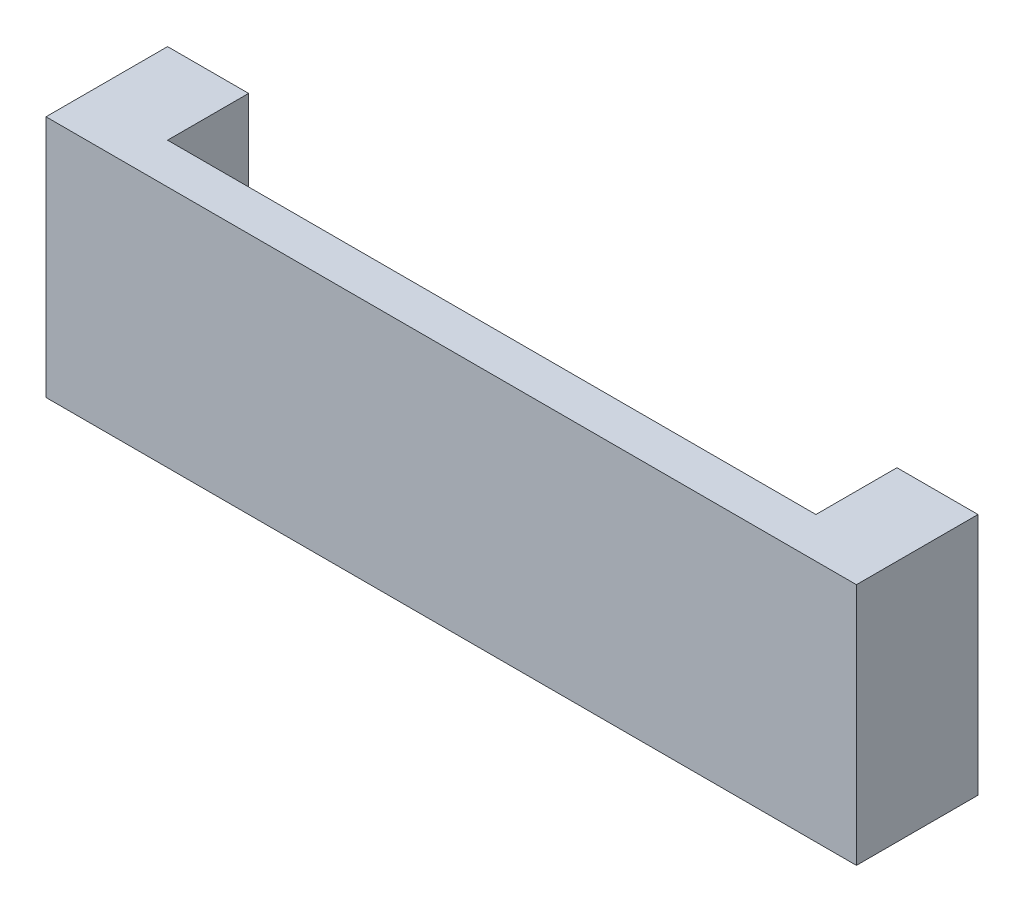
ISO-10303-21;
HEADER;
FILE_DESCRIPTION(('STEP AP214'),'2;1');
FILE_NAME('part.step','',(''),(''),'','','');
FILE_SCHEMA(('AUTOMOTIVE_DESIGN { 1 0 10303 214 1 1 1 1 }'));
ENDSEC;
DATA;
#1=APPLICATION_CONTEXT('core data for automotive mechanical design processes');
#2=APPLICATION_PROTOCOL_DEFINITION('international standard','automotive_design',2000,#1);
#3=PRODUCT_CONTEXT('',#1,'mechanical');
#4=PRODUCT('Part','Part','',(#3));
#5=PRODUCT_RELATED_PRODUCT_CATEGORY('part','',(#4));
#6=PRODUCT_DEFINITION_FORMATION('','',#4);
#7=PRODUCT_DEFINITION_CONTEXT('part definition',#1,'design');
#8=PRODUCT_DEFINITION('design','',#6,#7);
#9=PRODUCT_DEFINITION_SHAPE('','',#8);
#10=(LENGTH_UNIT() NAMED_UNIT(*) SI_UNIT(.MILLI.,.METRE.));
#11=(NAMED_UNIT(*) PLANE_ANGLE_UNIT() SI_UNIT($,.RADIAN.));
#12=(NAMED_UNIT(*) SI_UNIT($,.STERADIAN.) SOLID_ANGLE_UNIT());
#13=UNCERTAINTY_MEASURE_WITH_UNIT(LENGTH_MEASURE(1.E-05),#10,'distance_accuracy_value','');
#14=(GEOMETRIC_REPRESENTATION_CONTEXT(3) GLOBAL_UNCERTAINTY_ASSIGNED_CONTEXT((#13)) GLOBAL_UNIT_ASSIGNED_CONTEXT((#10,
#11,#12)) REPRESENTATION_CONTEXT('',''));
#15=CARTESIAN_POINT('',(0.,0.,0.));
#16=DIRECTION('',(0.,0.,1.));
#17=DIRECTION('',(1.,0.,0.));
#18=AXIS2_PLACEMENT_3D('',#15,#16,#17);
#19=CARTESIAN_POINT('',(-50.,30.,0.));
#20=DIRECTION('',(1.,0.,0.));
#21=DIRECTION('',(0.,0.,-1.));
#22=AXIS2_PLACEMENT_3D('',#19,#20,#21);
#23=PLANE('',#22);
#24=DIRECTION('',(0.,0.,1.));
#25=VECTOR('',#24,1.);
#26=CARTESIAN_POINT('',(-50.,0.,0.));
#27=LINE('',#26,#25);
#28=CARTESIAN_POINT('',(-50.,0.,0.));
#29=VERTEX_POINT('',#28);
#30=CARTESIAN_POINT('',(-50.,0.,15.));
#31=VERTEX_POINT('',#30);
#32=EDGE_CURVE('E140',#29,#31,#27,.T.);
#33=ORIENTED_EDGE('',*,*,#32,.T.);
#34=DIRECTION('',(0.,-1.,0.));
#35=VECTOR('',#34,1.);
#36=CARTESIAN_POINT('',(-50.,30.,15.));
#37=LINE('',#36,#35);
#38=CARTESIAN_POINT('',(-50.,30.,15.));
#39=VERTEX_POINT('',#38);
#40=EDGE_CURVE('E11',#39,#31,#37,.T.);
#41=ORIENTED_EDGE('',*,*,#40,.F.);
#42=DIRECTION('',(0.,0.,1.));
#43=VECTOR('',#42,1.);
#44=CARTESIAN_POINT('',(-50.,30.,0.));
#45=LINE('',#44,#43);
#46=CARTESIAN_POINT('',(-50.,30.,0.));
#47=VERTEX_POINT('',#46);
#48=EDGE_CURVE('E162',#47,#39,#45,.T.);
#49=ORIENTED_EDGE('',*,*,#48,.F.);
#50=DIRECTION('',(0.,-1.,0.));
#51=VECTOR('',#50,1.);
#52=CARTESIAN_POINT('',(-50.,30.,0.));
#53=LINE('',#52,#51);
#54=EDGE_CURVE('E136',#47,#29,#53,.T.);
#55=ORIENTED_EDGE('',*,*,#54,.T.);
#56=EDGE_LOOP('',(#33,#41,#49,#55));
#57=FACE_BOUND('',#56,.T.);
#58=ADVANCED_FACE('F39',(#57),#23,.F.);
#59=CARTESIAN_POINT('',(-50.,30.,15.));
#60=DIRECTION('',(0.,0.,-1.));
#61=DIRECTION('',(-1.,0.,0.));
#62=AXIS2_PLACEMENT_3D('',#59,#60,#61);
#63=PLANE('',#62);
#64=DIRECTION('',(1.,0.,0.));
#65=VECTOR('',#64,1.);
#66=CARTESIAN_POINT('',(-50.,0.,15.));
#67=LINE('',#66,#65);
#68=CARTESIAN_POINT('',(50.,0.,15.));
#69=VERTEX_POINT('',#68);
#70=EDGE_CURVE('E144',#31,#69,#67,.T.);
#71=ORIENTED_EDGE('',*,*,#70,.T.);
#72=DIRECTION('',(0.,-1.,0.));
#73=VECTOR('',#72,1.);
#74=CARTESIAN_POINT('',(50.,30.,15.));
#75=LINE('',#74,#73);
#76=CARTESIAN_POINT('',(50.,30.,15.));
#77=VERTEX_POINT('',#76);
#78=EDGE_CURVE('E48',#77,#69,#75,.T.);
#79=ORIENTED_EDGE('',*,*,#78,.F.);
#80=DIRECTION('',(1.,0.,0.));
#81=VECTOR('',#80,1.);
#82=CARTESIAN_POINT('',(-50.,30.,15.));
#83=LINE('',#82,#81);
#84=EDGE_CURVE('E99',#39,#77,#83,.T.);
#85=ORIENTED_EDGE('',*,*,#84,.F.);
#86=ORIENTED_EDGE('',*,*,#40,.T.);
#87=EDGE_LOOP('',(#71,#79,#85,#86));
#88=FACE_BOUND('',#87,.T.);
#89=ADVANCED_FACE('F208',(#88),#63,.F.);
#90=CARTESIAN_POINT('',(50.,30.,0.));
#91=DIRECTION('',(-1.,0.,0.));
#92=DIRECTION('',(0.,0.,1.));
#93=AXIS2_PLACEMENT_3D('',#90,#91,#92);
#94=PLANE('',#93);
#95=DIRECTION('',(0.,0.,-1.));
#96=VECTOR('',#95,1.);
#97=CARTESIAN_POINT('',(50.,0.,0.));
#98=LINE('',#97,#96);
#99=CARTESIAN_POINT('',(50.,0.,0.));
#100=VERTEX_POINT('',#99);
#101=EDGE_CURVE('E147',#69,#100,#98,.T.);
#102=ORIENTED_EDGE('',*,*,#101,.T.);
#103=DIRECTION('',(0.,-1.,0.));
#104=VECTOR('',#103,1.);
#105=CARTESIAN_POINT('',(50.,30.,0.));
#106=LINE('',#105,#104);
#107=CARTESIAN_POINT('',(50.,30.,0.));
#108=VERTEX_POINT('',#107);
#109=EDGE_CURVE('E173',#108,#100,#106,.T.);
#110=ORIENTED_EDGE('',*,*,#109,.F.);
#111=DIRECTION('',(0.,0.,-1.));
#112=VECTOR('',#111,1.);
#113=CARTESIAN_POINT('',(50.,30.,0.));
#114=LINE('',#113,#112);
#115=EDGE_CURVE('E183',#77,#108,#114,.T.);
#116=ORIENTED_EDGE('',*,*,#115,.F.);
#117=ORIENTED_EDGE('',*,*,#78,.T.);
#118=EDGE_LOOP('',(#102,#110,#116,#117));
#119=FACE_BOUND('',#118,.T.);
#120=ADVANCED_FACE('F181',(#119),#94,.F.);
#121=CARTESIAN_POINT('',(50.,30.,0.));
#122=DIRECTION('',(0.,0.,1.));
#123=DIRECTION('',(1.,0.,0.));
#124=AXIS2_PLACEMENT_3D('',#121,#122,#123);
#125=PLANE('',#124);
#126=DIRECTION('',(-1.,0.,0.));
#127=VECTOR('',#126,1.);
#128=CARTESIAN_POINT('',(50.,0.,0.));
#129=LINE('',#128,#127);
#130=CARTESIAN_POINT('',(40.,0.,0.));
#131=VERTEX_POINT('',#130);
#132=EDGE_CURVE('E150',#100,#131,#129,.T.);
#133=ORIENTED_EDGE('',*,*,#132,.T.);
#134=DIRECTION('',(0.,-1.,0.));
#135=VECTOR('',#134,1.);
#136=CARTESIAN_POINT('',(40.,30.,0.));
#137=LINE('',#136,#135);
#138=CARTESIAN_POINT('',(40.,30.,0.));
#139=VERTEX_POINT('',#138);
#140=EDGE_CURVE('E169',#139,#131,#137,.T.);
#141=ORIENTED_EDGE('',*,*,#140,.F.);
#142=DIRECTION('',(-1.,0.,0.));
#143=VECTOR('',#142,1.);
#144=CARTESIAN_POINT('',(50.,30.,0.));
#145=LINE('',#144,#143);
#146=EDGE_CURVE('E196',#108,#139,#145,.T.);
#147=ORIENTED_EDGE('',*,*,#146,.F.);
#148=ORIENTED_EDGE('',*,*,#109,.T.);
#149=EDGE_LOOP('',(#133,#141,#147,#148));
#150=FACE_BOUND('',#149,.T.);
#151=ADVANCED_FACE('F191',(#150),#125,.F.);
#152=CARTESIAN_POINT('',(40.,30.,0.));
#153=DIRECTION('',(1.,0.,0.));
#154=DIRECTION('',(0.,0.,-1.));
#155=AXIS2_PLACEMENT_3D('',#152,#153,#154);
#156=PLANE('',#155);
#157=DIRECTION('',(0.,0.,1.));
#158=VECTOR('',#157,1.);
#159=CARTESIAN_POINT('',(40.,0.,0.));
#160=LINE('',#159,#158);
#161=CARTESIAN_POINT('',(40.,0.,10.));
#162=VERTEX_POINT('',#161);
#163=EDGE_CURVE('E153',#131,#162,#160,.T.);
#164=ORIENTED_EDGE('',*,*,#163,.T.);
#165=DIRECTION('',(0.,-1.,0.));
#166=VECTOR('',#165,1.);
#167=CARTESIAN_POINT('',(40.,30.,10.));
#168=LINE('',#167,#166);
#169=CARTESIAN_POINT('',(40.,30.,10.));
#170=VERTEX_POINT('',#169);
#171=EDGE_CURVE('E129',#170,#162,#168,.T.);
#172=ORIENTED_EDGE('',*,*,#171,.F.);
#173=DIRECTION('',(0.,0.,1.));
#174=VECTOR('',#173,1.);
#175=CARTESIAN_POINT('',(40.,30.,0.));
#176=LINE('',#175,#174);
#177=EDGE_CURVE('E118',#139,#170,#176,.T.);
#178=ORIENTED_EDGE('',*,*,#177,.F.);
#179=ORIENTED_EDGE('',*,*,#140,.T.);
#180=EDGE_LOOP('',(#164,#172,#178,#179));
#181=FACE_BOUND('',#180,.T.);
#182=ADVANCED_FACE('F194',(#181),#156,.F.);
#183=CARTESIAN_POINT('',(-40.,30.,10.));
#184=DIRECTION('',(0.,0.,1.));
#185=DIRECTION('',(1.,0.,0.));
#186=AXIS2_PLACEMENT_3D('',#183,#184,#185);
#187=PLANE('',#186);
#188=DIRECTION('',(-1.,0.,0.));
#189=VECTOR('',#188,1.);
#190=CARTESIAN_POINT('',(-40.,0.,10.));
#191=LINE('',#190,#189);
#192=CARTESIAN_POINT('',(-40.,0.,10.));
#193=VERTEX_POINT('',#192);
#194=EDGE_CURVE('E127',#162,#193,#191,.T.);
#195=ORIENTED_EDGE('',*,*,#194,.T.);
#196=DIRECTION('',(0.,-1.,0.));
#197=VECTOR('',#196,1.);
#198=CARTESIAN_POINT('',(-40.,30.,10.));
#199=LINE('',#198,#197);
#200=CARTESIAN_POINT('',(-40.,30.,10.));
#201=VERTEX_POINT('',#200);
#202=EDGE_CURVE('E124',#201,#193,#199,.T.);
#203=ORIENTED_EDGE('',*,*,#202,.F.);
#204=DIRECTION('',(-1.,0.,0.));
#205=VECTOR('',#204,1.);
#206=CARTESIAN_POINT('',(-40.,30.,10.));
#207=LINE('',#206,#205);
#208=EDGE_CURVE('E112',#170,#201,#207,.T.);
#209=ORIENTED_EDGE('',*,*,#208,.F.);
#210=ORIENTED_EDGE('',*,*,#171,.T.);
#211=EDGE_LOOP('',(#195,#203,#209,#210));
#212=FACE_BOUND('',#211,.T.);
#213=ADVANCED_FACE('F125',(#212),#187,.F.);
#214=CARTESIAN_POINT('',(-40.,30.,0.));
#215=DIRECTION('',(-1.,0.,0.));
#216=DIRECTION('',(0.,0.,1.));
#217=AXIS2_PLACEMENT_3D('',#214,#215,#216);
#218=PLANE('',#217);
#219=DIRECTION('',(0.,0.,-1.));
#220=VECTOR('',#219,1.);
#221=CARTESIAN_POINT('',(-40.,0.,0.));
#222=LINE('',#221,#220);
#223=CARTESIAN_POINT('',(-40.,0.,0.));
#224=VERTEX_POINT('',#223);
#225=EDGE_CURVE('E85',#193,#224,#222,.T.);
#226=ORIENTED_EDGE('',*,*,#225,.T.);
#227=DIRECTION('',(0.,-1.,0.));
#228=VECTOR('',#227,1.);
#229=CARTESIAN_POINT('',(-40.,30.,0.));
#230=LINE('',#229,#228);
#231=CARTESIAN_POINT('',(-40.,30.,0.));
#232=VERTEX_POINT('',#231);
#233=EDGE_CURVE('E130',#232,#224,#230,.T.);
#234=ORIENTED_EDGE('',*,*,#233,.F.);
#235=DIRECTION('',(0.,0.,-1.));
#236=VECTOR('',#235,1.);
#237=CARTESIAN_POINT('',(-40.,30.,0.));
#238=LINE('',#237,#236);
#239=EDGE_CURVE('E116',#201,#232,#238,.T.);
#240=ORIENTED_EDGE('',*,*,#239,.F.);
#241=ORIENTED_EDGE('',*,*,#202,.T.);
#242=EDGE_LOOP('',(#226,#234,#240,#241));
#243=FACE_BOUND('',#242,.T.);
#244=ADVANCED_FACE('F132',(#243),#218,.F.);
#245=CARTESIAN_POINT('',(-50.,30.,0.));
#246=DIRECTION('',(0.,0.,1.));
#247=DIRECTION('',(1.,0.,0.));
#248=AXIS2_PLACEMENT_3D('',#245,#246,#247);
#249=PLANE('',#248);
#250=DIRECTION('',(-1.,0.,0.));
#251=VECTOR('',#250,1.);
#252=CARTESIAN_POINT('',(-50.,0.,0.));
#253=LINE('',#252,#251);
#254=EDGE_CURVE('E91',#224,#29,#253,.T.);
#255=ORIENTED_EDGE('',*,*,#254,.T.);
#256=ORIENTED_EDGE('',*,*,#54,.F.);
#257=DIRECTION('',(-1.,0.,0.));
#258=VECTOR('',#257,1.);
#259=CARTESIAN_POINT('',(-50.,30.,0.));
#260=LINE('',#259,#258);
#261=EDGE_CURVE('E56',#232,#47,#260,.T.);
#262=ORIENTED_EDGE('',*,*,#261,.F.);
#263=ORIENTED_EDGE('',*,*,#233,.T.);
#264=EDGE_LOOP('',(#255,#256,#262,#263));
#265=FACE_BOUND('',#264,.T.);
#266=ADVANCED_FACE('F224',(#265),#249,.F.);
#267=CARTESIAN_POINT('',(0.,30.,0.));
#268=DIRECTION('',(0.,1.,0.));
#269=DIRECTION('',(0.,0.,1.));
#270=AXIS2_PLACEMENT_3D('',#267,#268,#269);
#271=PLANE('',#270);
#272=ORIENTED_EDGE('',*,*,#48,.T.);
#273=ORIENTED_EDGE('',*,*,#84,.T.);
#274=ORIENTED_EDGE('',*,*,#115,.T.);
#275=ORIENTED_EDGE('',*,*,#146,.T.);
#276=ORIENTED_EDGE('',*,*,#177,.T.);
#277=ORIENTED_EDGE('',*,*,#208,.T.);
#278=ORIENTED_EDGE('',*,*,#239,.T.);
#279=ORIENTED_EDGE('',*,*,#261,.T.);
#280=EDGE_LOOP('',(#272,#273,#274,#275,#276,#277,#278,#279));
#281=FACE_BOUND('',#280,.T.);
#282=ADVANCED_FACE('F114',(#281),#271,.T.);
#283=CARTESIAN_POINT('',(0.,0.,0.));
#284=DIRECTION('',(0.,1.,0.));
#285=DIRECTION('',(0.,0.,1.));
#286=AXIS2_PLACEMENT_3D('',#283,#284,#285);
#287=PLANE('',#286);
#288=ORIENTED_EDGE('',*,*,#32,.F.);
#289=ORIENTED_EDGE('',*,*,#254,.F.);
#290=ORIENTED_EDGE('',*,*,#225,.F.);
#291=ORIENTED_EDGE('',*,*,#194,.F.);
#292=ORIENTED_EDGE('',*,*,#163,.F.);
#293=ORIENTED_EDGE('',*,*,#132,.F.);
#294=ORIENTED_EDGE('',*,*,#101,.F.);
#295=ORIENTED_EDGE('',*,*,#70,.F.);
#296=EDGE_LOOP('',(#288,#289,#290,#291,#292,#293,#294,#295));
#297=FACE_BOUND('',#296,.T.);
#298=ADVANCED_FACE('F187',(#297),#287,.F.);
#299=CLOSED_SHELL('',(#58,#89,#120,#151,#182,#213,#244,#266,#282,#298));
#300=MANIFOLD_SOLID_BREP('B2',#299);
#301=ADVANCED_BREP_SHAPE_REPRESENTATION('',(#18,#300),#14);
#302=SHAPE_DEFINITION_REPRESENTATION(#9,#301);
ENDSEC;
END-ISO-10303-21;
